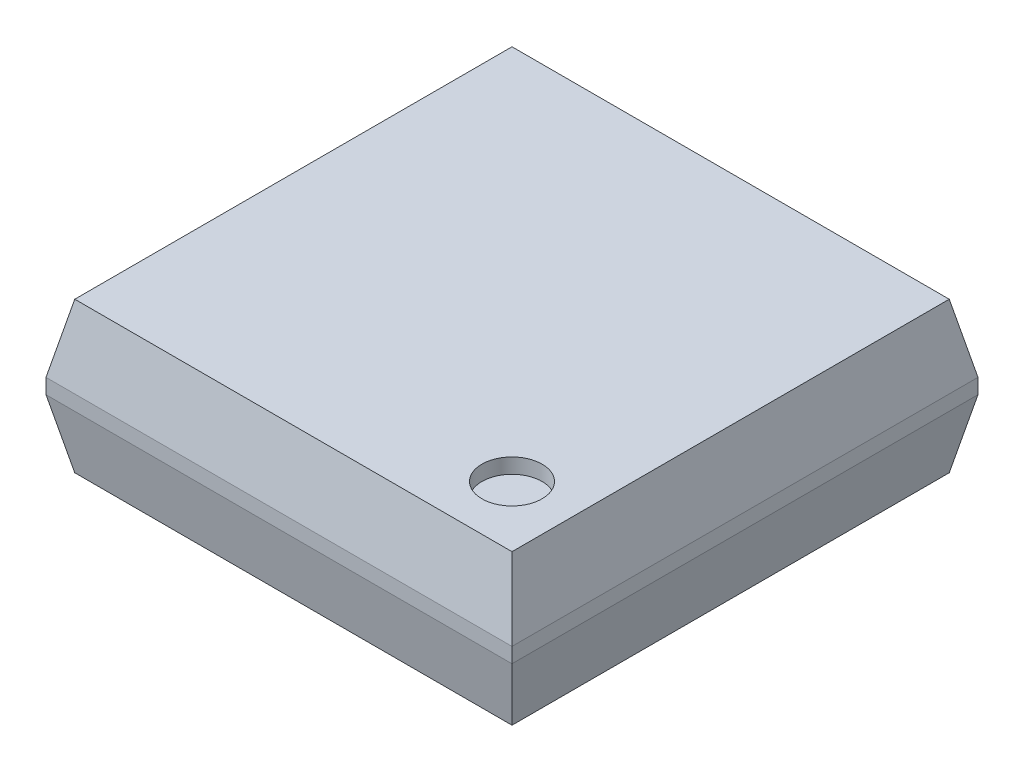
ISO-10303-21;
HEADER;
FILE_DESCRIPTION(('STEP AP214'),'2;1');
FILE_NAME('part.step','',(''),(''),'','','');
FILE_SCHEMA(('AUTOMOTIVE_DESIGN { 1 0 10303 214 1 1 1 1 }'));
ENDSEC;
DATA;
#1=APPLICATION_CONTEXT('core data for automotive mechanical design processes');
#2=APPLICATION_PROTOCOL_DEFINITION('international standard','automotive_design',2000,#1);
#3=PRODUCT_CONTEXT('',#1,'mechanical');
#4=PRODUCT('Part','Part','',(#3));
#5=PRODUCT_RELATED_PRODUCT_CATEGORY('part','',(#4));
#6=PRODUCT_DEFINITION_FORMATION('','',#4);
#7=PRODUCT_DEFINITION_CONTEXT('part definition',#1,'design');
#8=PRODUCT_DEFINITION('design','',#6,#7);
#9=PRODUCT_DEFINITION_SHAPE('','',#8);
#10=(LENGTH_UNIT() NAMED_UNIT(*) SI_UNIT(.MILLI.,.METRE.));
#11=(NAMED_UNIT(*) PLANE_ANGLE_UNIT() SI_UNIT($,.RADIAN.));
#12=(NAMED_UNIT(*) SI_UNIT($,.STERADIAN.) SOLID_ANGLE_UNIT());
#13=UNCERTAINTY_MEASURE_WITH_UNIT(LENGTH_MEASURE(1.E-05),#10,'distance_accuracy_value','');
#14=(GEOMETRIC_REPRESENTATION_CONTEXT(3) GLOBAL_UNCERTAINTY_ASSIGNED_CONTEXT((#13)) GLOBAL_UNIT_ASSIGNED_CONTEXT((#10,
#11,#12)) REPRESENTATION_CONTEXT('',''));
#15=CARTESIAN_POINT('',(0.,0.,0.));
#16=DIRECTION('',(0.,0.,1.));
#17=DIRECTION('',(1.,0.,0.));
#18=AXIS2_PLACEMENT_3D('',#15,#16,#17);
#19=CARTESIAN_POINT('',(-1.55,-0.5,1.55));
#20=DIRECTION('',(0.,1.,0.));
#21=DIRECTION('',(1.,0.,0.));
#22=AXIS2_PLACEMENT_3D('',#19,#20,#21);
#23=PLANE('',#22);
#24=DIRECTION('',(0.,0.,-1.));
#25=VECTOR('',#24,1.);
#26=CARTESIAN_POINT('',(1.454349547248,-0.5,1.55));
#27=LINE('',#26,#25);
#28=CARTESIAN_POINT('',(1.454349547248,-0.5,1.454349547248));
#29=VERTEX_POINT('',#28);
#30=CARTESIAN_POINT('',(1.454349547248,-0.5,-1.454349547248));
#31=VERTEX_POINT('',#30);
#32=EDGE_CURVE('E28',#29,#31,#27,.T.);
#33=ORIENTED_EDGE('',*,*,#32,.F.);
#34=DIRECTION('',(1.,0.,0.));
#35=VECTOR('',#34,1.);
#36=CARTESIAN_POINT('',(-1.55,-0.5,1.454349547248));
#37=LINE('',#36,#35);
#38=CARTESIAN_POINT('',(-1.454349547248,-0.5,1.454349547248));
#39=VERTEX_POINT('',#38);
#40=EDGE_CURVE('E141',#39,#29,#37,.T.);
#41=ORIENTED_EDGE('',*,*,#40,.F.);
#42=DIRECTION('',(0.,0.,1.));
#43=VECTOR('',#42,1.);
#44=CARTESIAN_POINT('',(-1.454349547248,-0.5,1.55));
#45=LINE('',#44,#43);
#46=CARTESIAN_POINT('',(-1.454349547248,-0.5,-1.454349547248));
#47=VERTEX_POINT('',#46);
#48=EDGE_CURVE('E164',#47,#39,#45,.T.);
#49=ORIENTED_EDGE('',*,*,#48,.F.);
#50=DIRECTION('',(-1.,0.,0.));
#51=VECTOR('',#50,1.);
#52=CARTESIAN_POINT('',(-1.55,-0.5,-1.454349547248));
#53=LINE('',#52,#51);
#54=EDGE_CURVE('E11',#31,#47,#53,.T.);
#55=ORIENTED_EDGE('',*,*,#54,.F.);
#56=EDGE_LOOP('',(#33,#41,#49,#55));
#57=FACE_BOUND('',#56,.T.);
#58=ADVANCED_FACE('F17',(#57),#23,.F.);
#59=CARTESIAN_POINT('',(-1.55,-0.04999999999999,-1.55));
#60=DIRECTION('',(0.,-0.20791169081795,-0.978147600733765));
#61=DIRECTION('',(0.,-0.978147600733765,0.20791169081795));
#62=AXIS2_PLACEMENT_3D('',#59,#60,#61);
#63=PLANE('',#62);
#64=DIRECTION('',(-0.203558594952977,-0.957667894857889,0.203558594952977));
#65=VECTOR('',#64,1.);
#66=CARTESIAN_POINT('',(1.55,-0.04999999999999,-1.55));
#67=LINE('',#66,#65);
#68=CARTESIAN_POINT('',(1.55,-0.04999999999999,-1.55));
#69=VERTEX_POINT('',#68);
#70=EDGE_CURVE('E139',#69,#31,#67,.T.);
#71=ORIENTED_EDGE('',*,*,#70,.T.);
#72=ORIENTED_EDGE('',*,*,#54,.T.);
#73=DIRECTION('',(-0.203558594952977,0.957667894857889,-0.203558594952977));
#74=VECTOR('',#73,1.);
#75=CARTESIAN_POINT('',(-1.454349547248,-0.5,-1.454349547248));
#76=LINE('',#75,#74);
#77=CARTESIAN_POINT('',(-1.55,-0.04999999999999,-1.55));
#78=VERTEX_POINT('',#77);
#79=EDGE_CURVE('E161',#47,#78,#76,.T.);
#80=ORIENTED_EDGE('',*,*,#79,.T.);
#81=DIRECTION('',(1.,0.,0.));
#82=VECTOR('',#81,1.);
#83=CARTESIAN_POINT('',(-1.55,-0.04999999999999,-1.55));
#84=LINE('',#83,#82);
#85=EDGE_CURVE('E182',#78,#69,#84,.T.);
#86=ORIENTED_EDGE('',*,*,#85,.T.);
#87=EDGE_LOOP('',(#71,#72,#80,#86));
#88=FACE_BOUND('',#87,.T.);
#89=ADVANCED_FACE('F240',(#88),#63,.T.);
#90=CARTESIAN_POINT('',(1.55,-0.04999999999999,-1.55));
#91=DIRECTION('',(0.978147600733765,-0.20791169081795,0.));
#92=DIRECTION('',(0.,0.,-1.));
#93=AXIS2_PLACEMENT_3D('',#90,#91,#92);
#94=PLANE('',#93);
#95=ORIENTED_EDGE('',*,*,#70,.F.);
#96=DIRECTION('',(0.,0.,1.));
#97=VECTOR('',#96,1.);
#98=CARTESIAN_POINT('',(1.55,-0.04999999999999,-1.55));
#99=LINE('',#98,#97);
#100=CARTESIAN_POINT('',(1.55,-0.04999999999999,1.55));
#101=VERTEX_POINT('',#100);
#102=EDGE_CURVE('E194',#69,#101,#99,.T.);
#103=ORIENTED_EDGE('',*,*,#102,.T.);
#104=DIRECTION('',(-0.203558594952977,-0.957667894857889,-0.203558594952977));
#105=VECTOR('',#104,1.);
#106=CARTESIAN_POINT('',(1.55,-0.04999999999999,1.55));
#107=LINE('',#106,#105);
#108=EDGE_CURVE('E195',#101,#29,#107,.T.);
#109=ORIENTED_EDGE('',*,*,#108,.T.);
#110=ORIENTED_EDGE('',*,*,#32,.T.);
#111=EDGE_LOOP('',(#95,#103,#109,#110));
#112=FACE_BOUND('',#111,.T.);
#113=ADVANCED_FACE('F267',(#112),#94,.T.);
#114=CARTESIAN_POINT('',(-1.55,-0.04999999999999,1.55));
#115=DIRECTION('',(0.,-0.20791169081795,0.978147600733765));
#116=DIRECTION('',(-1.,0.,0.));
#117=AXIS2_PLACEMENT_3D('',#114,#115,#116);
#118=PLANE('',#117);
#119=ORIENTED_EDGE('',*,*,#108,.F.);
#120=DIRECTION('',(-1.,0.,0.));
#121=VECTOR('',#120,1.);
#122=CARTESIAN_POINT('',(-1.55,-0.04999999999999,1.55));
#123=LINE('',#122,#121);
#124=CARTESIAN_POINT('',(-1.55,-0.04999999999999,1.55));
#125=VERTEX_POINT('',#124);
#126=EDGE_CURVE('E148',#101,#125,#123,.T.);
#127=ORIENTED_EDGE('',*,*,#126,.T.);
#128=DIRECTION('',(0.203558594952977,-0.957667894857889,-0.203558594952977));
#129=VECTOR('',#128,1.);
#130=CARTESIAN_POINT('',(-1.55,-0.04999999999999,1.55));
#131=LINE('',#130,#129);
#132=EDGE_CURVE('E165',#125,#39,#131,.T.);
#133=ORIENTED_EDGE('',*,*,#132,.T.);
#134=ORIENTED_EDGE('',*,*,#40,.T.);
#135=EDGE_LOOP('',(#119,#127,#133,#134));
#136=FACE_BOUND('',#135,.T.);
#137=ADVANCED_FACE('F265',(#136),#118,.T.);
#138=CARTESIAN_POINT('',(-1.55,-0.04999999999999,-1.55));
#139=DIRECTION('',(-0.978147600733765,-0.20791169081795,0.));
#140=DIRECTION('',(-0.20791169081795,0.978147600733765,0.));
#141=AXIS2_PLACEMENT_3D('',#138,#139,#140);
#142=PLANE('',#141);
#143=ORIENTED_EDGE('',*,*,#132,.F.);
#144=DIRECTION('',(0.,0.,-1.));
#145=VECTOR('',#144,1.);
#146=CARTESIAN_POINT('',(-1.55,-0.04999999999999,-1.55));
#147=LINE('',#146,#145);
#148=EDGE_CURVE('E94',#125,#78,#147,.T.);
#149=ORIENTED_EDGE('',*,*,#148,.T.);
#150=ORIENTED_EDGE('',*,*,#79,.F.);
#151=ORIENTED_EDGE('',*,*,#48,.T.);
#152=EDGE_LOOP('',(#143,#149,#150,#151));
#153=FACE_BOUND('',#152,.T.);
#154=ADVANCED_FACE('F246',(#153),#142,.T.);
#155=CARTESIAN_POINT('',(-1.55,-0.5,-1.55));
#156=DIRECTION('',(0.,0.,-1.));
#157=DIRECTION('',(0.,-1.,0.));
#158=AXIS2_PLACEMENT_3D('',#155,#156,#157);
#159=PLANE('',#158);
#160=DIRECTION('',(0.,1.,0.));
#161=VECTOR('',#160,1.);
#162=CARTESIAN_POINT('',(-1.55,-0.5,-1.55));
#163=LINE('',#162,#161);
#164=CARTESIAN_POINT('',(-1.55,0.04999999999999,-1.55));
#165=VERTEX_POINT('',#164);
#166=EDGE_CURVE('E98',#78,#165,#163,.T.);
#167=ORIENTED_EDGE('',*,*,#166,.T.);
#168=DIRECTION('',(1.,0.,0.));
#169=VECTOR('',#168,1.);
#170=CARTESIAN_POINT('',(-1.55,0.04999999999999,-1.55));
#171=LINE('',#170,#169);
#172=CARTESIAN_POINT('',(1.55,0.04999999999999,-1.55));
#173=VERTEX_POINT('',#172);
#174=EDGE_CURVE('E99',#165,#173,#171,.T.);
#175=ORIENTED_EDGE('',*,*,#174,.T.);
#176=DIRECTION('',(0.,-1.,0.));
#177=VECTOR('',#176,1.);
#178=CARTESIAN_POINT('',(1.55,-0.5,-1.55));
#179=LINE('',#178,#177);
#180=EDGE_CURVE('E152',#173,#69,#179,.T.);
#181=ORIENTED_EDGE('',*,*,#180,.T.);
#182=ORIENTED_EDGE('',*,*,#85,.F.);
#183=EDGE_LOOP('',(#167,#175,#181,#182));
#184=FACE_BOUND('',#183,.T.);
#185=ADVANCED_FACE('F249',(#184),#159,.T.);
#186=CARTESIAN_POINT('',(1.55,-0.5,-1.55));
#187=DIRECTION('',(1.,0.,0.));
#188=DIRECTION('',(0.,1.,0.));
#189=AXIS2_PLACEMENT_3D('',#186,#187,#188);
#190=PLANE('',#189);
#191=ORIENTED_EDGE('',*,*,#180,.F.);
#192=DIRECTION('',(0.,0.,1.));
#193=VECTOR('',#192,1.);
#194=CARTESIAN_POINT('',(1.55,0.04999999999999,-1.55));
#195=LINE('',#194,#193);
#196=CARTESIAN_POINT('',(1.55,0.04999999999999,1.55));
#197=VERTEX_POINT('',#196);
#198=EDGE_CURVE('E21',#173,#197,#195,.T.);
#199=ORIENTED_EDGE('',*,*,#198,.T.);
#200=DIRECTION('',(0.,-1.,0.));
#201=VECTOR('',#200,1.);
#202=CARTESIAN_POINT('',(1.55,-0.5,1.55));
#203=LINE('',#202,#201);
#204=EDGE_CURVE('E106',#197,#101,#203,.T.);
#205=ORIENTED_EDGE('',*,*,#204,.T.);
#206=ORIENTED_EDGE('',*,*,#102,.F.);
#207=EDGE_LOOP('',(#191,#199,#205,#206));
#208=FACE_BOUND('',#207,.T.);
#209=ADVANCED_FACE('F19',(#208),#190,.T.);
#210=CARTESIAN_POINT('',(-1.55,-0.5,1.55));
#211=DIRECTION('',(0.,0.,1.));
#212=DIRECTION('',(1.,0.,0.));
#213=AXIS2_PLACEMENT_3D('',#210,#211,#212);
#214=PLANE('',#213);
#215=ORIENTED_EDGE('',*,*,#204,.F.);
#216=DIRECTION('',(-1.,0.,0.));
#217=VECTOR('',#216,1.);
#218=CARTESIAN_POINT('',(-1.55,0.04999999999999,1.55));
#219=LINE('',#218,#217);
#220=CARTESIAN_POINT('',(-1.55,0.04999999999999,1.55));
#221=VERTEX_POINT('',#220);
#222=EDGE_CURVE('E102',#197,#221,#219,.T.);
#223=ORIENTED_EDGE('',*,*,#222,.T.);
#224=DIRECTION('',(0.,-1.,0.));
#225=VECTOR('',#224,1.);
#226=CARTESIAN_POINT('',(-1.55,-0.5,1.55));
#227=LINE('',#226,#225);
#228=EDGE_CURVE('E87',#221,#125,#227,.T.);
#229=ORIENTED_EDGE('',*,*,#228,.T.);
#230=ORIENTED_EDGE('',*,*,#126,.F.);
#231=EDGE_LOOP('',(#215,#223,#229,#230));
#232=FACE_BOUND('',#231,.T.);
#233=ADVANCED_FACE('F104',(#232),#214,.T.);
#234=CARTESIAN_POINT('',(-1.55,-0.5,-1.55));
#235=DIRECTION('',(-1.,0.,0.));
#236=DIRECTION('',(0.,0.,1.));
#237=AXIS2_PLACEMENT_3D('',#234,#235,#236);
#238=PLANE('',#237);
#239=ORIENTED_EDGE('',*,*,#228,.F.);
#240=DIRECTION('',(0.,0.,-1.));
#241=VECTOR('',#240,1.);
#242=CARTESIAN_POINT('',(-1.55,0.04999999999999,-1.55));
#243=LINE('',#242,#241);
#244=EDGE_CURVE('E92',#221,#165,#243,.T.);
#245=ORIENTED_EDGE('',*,*,#244,.T.);
#246=ORIENTED_EDGE('',*,*,#166,.F.);
#247=ORIENTED_EDGE('',*,*,#148,.F.);
#248=EDGE_LOOP('',(#239,#245,#246,#247));
#249=FACE_BOUND('',#248,.T.);
#250=ADVANCED_FACE('F89',(#249),#238,.T.);
#251=CARTESIAN_POINT('',(-1.55,0.5,-1.454349547248));
#252=DIRECTION('',(0.,-0.20791169081795,0.978147600733765));
#253=DIRECTION('',(-1.,0.,0.));
#254=AXIS2_PLACEMENT_3D('',#251,#252,#253);
#255=PLANE('',#254);
#256=ORIENTED_EDGE('',*,*,#174,.F.);
#257=DIRECTION('',(-0.203558594952977,-0.957667894857889,-0.203558594952977));
#258=VECTOR('',#257,1.);
#259=CARTESIAN_POINT('',(-1.454349547248,0.5,-1.454349547248));
#260=LINE('',#259,#258);
#261=CARTESIAN_POINT('',(-1.454349547248,0.5,-1.454349547248));
#262=VERTEX_POINT('',#261);
#263=EDGE_CURVE('E112',#262,#165,#260,.T.);
#264=ORIENTED_EDGE('',*,*,#263,.F.);
#265=DIRECTION('',(-1.,0.,0.));
#266=VECTOR('',#265,1.);
#267=CARTESIAN_POINT('',(-1.55,0.5,-1.454349547248));
#268=LINE('',#267,#266);
#269=CARTESIAN_POINT('',(1.454349547248,0.5,-1.454349547248));
#270=VERTEX_POINT('',#269);
#271=EDGE_CURVE('E133',#270,#262,#268,.T.);
#272=ORIENTED_EDGE('',*,*,#271,.F.);
#273=DIRECTION('',(-0.203558594952977,0.957667894857889,0.203558594952977));
#274=VECTOR('',#273,1.);
#275=CARTESIAN_POINT('',(1.55,0.04999999999999,-1.55));
#276=LINE('',#275,#274);
#277=EDGE_CURVE('E186',#173,#270,#276,.T.);
#278=ORIENTED_EDGE('',*,*,#277,.F.);
#279=EDGE_LOOP('',(#256,#264,#272,#278));
#280=FACE_BOUND('',#279,.T.);
#281=ADVANCED_FACE('F251',(#280),#255,.F.);
#282=CARTESIAN_POINT('',(1.454349547248,0.5,1.55));
#283=DIRECTION('',(-0.978147600733765,-0.20791169081795,0.));
#284=DIRECTION('',(-0.20791169081795,0.978147600733765,0.));
#285=AXIS2_PLACEMENT_3D('',#282,#283,#284);
#286=PLANE('',#285);
#287=ORIENTED_EDGE('',*,*,#198,.F.);
#288=ORIENTED_EDGE('',*,*,#277,.T.);
#289=DIRECTION('',(0.,0.,-1.));
#290=VECTOR('',#289,1.);
#291=CARTESIAN_POINT('',(1.454349547248,0.5,1.55));
#292=LINE('',#291,#290);
#293=CARTESIAN_POINT('',(1.454349547248,0.5,1.454349547248));
#294=VERTEX_POINT('',#293);
#295=EDGE_CURVE('E137',#294,#270,#292,.T.);
#296=ORIENTED_EDGE('',*,*,#295,.F.);
#297=DIRECTION('',(-0.203558594952977,0.957667894857889,-0.203558594952977));
#298=VECTOR('',#297,1.);
#299=CARTESIAN_POINT('',(1.55,0.04999999999999,1.55));
#300=LINE('',#299,#298);
#301=EDGE_CURVE('E111',#197,#294,#300,.T.);
#302=ORIENTED_EDGE('',*,*,#301,.F.);
#303=EDGE_LOOP('',(#287,#288,#296,#302));
#304=FACE_BOUND('',#303,.T.);
#305=ADVANCED_FACE('F218',(#304),#286,.F.);
#306=CARTESIAN_POINT('',(-1.55,0.5,1.454349547248));
#307=DIRECTION('',(0.,-0.20791169081795,-0.978147600733765));
#308=DIRECTION('',(0.,-0.978147600733765,0.20791169081795));
#309=AXIS2_PLACEMENT_3D('',#306,#307,#308);
#310=PLANE('',#309);
#311=DIRECTION('',(1.,0.,0.));
#312=VECTOR('',#311,1.);
#313=CARTESIAN_POINT('',(-1.55,0.5,1.454349547248));
#314=LINE('',#313,#312);
#315=CARTESIAN_POINT('',(-1.454349547248,0.5,1.454349547248));
#316=VERTEX_POINT('',#315);
#317=EDGE_CURVE('E118',#316,#294,#314,.T.);
#318=ORIENTED_EDGE('',*,*,#317,.F.);
#319=DIRECTION('',(0.203558594952977,0.957667894857889,-0.203558594952977));
#320=VECTOR('',#319,1.);
#321=CARTESIAN_POINT('',(-1.55,0.04999999999999,1.55));
#322=LINE('',#321,#320);
#323=EDGE_CURVE('E115',#221,#316,#322,.T.);
#324=ORIENTED_EDGE('',*,*,#323,.F.);
#325=ORIENTED_EDGE('',*,*,#222,.F.);
#326=ORIENTED_EDGE('',*,*,#301,.T.);
#327=EDGE_LOOP('',(#318,#324,#325,#326));
#328=FACE_BOUND('',#327,.T.);
#329=ADVANCED_FACE('F116',(#328),#310,.F.);
#330=CARTESIAN_POINT('',(-1.454349547248,0.5,1.55));
#331=DIRECTION('',(0.978147600733765,-0.20791169081795,0.));
#332=DIRECTION('',(0.,0.,-1.));
#333=AXIS2_PLACEMENT_3D('',#330,#331,#332);
#334=PLANE('',#333);
#335=ORIENTED_EDGE('',*,*,#244,.F.);
#336=ORIENTED_EDGE('',*,*,#323,.T.);
#337=DIRECTION('',(0.,0.,1.));
#338=VECTOR('',#337,1.);
#339=CARTESIAN_POINT('',(-1.454349547248,0.5,1.55));
#340=LINE('',#339,#338);
#341=EDGE_CURVE('E127',#262,#316,#340,.T.);
#342=ORIENTED_EDGE('',*,*,#341,.F.);
#343=ORIENTED_EDGE('',*,*,#263,.T.);
#344=EDGE_LOOP('',(#335,#336,#342,#343));
#345=FACE_BOUND('',#344,.T.);
#346=ADVANCED_FACE('F125',(#345),#334,.F.);
#347=CARTESIAN_POINT('',(-1.55,0.5,1.55));
#348=DIRECTION('',(0.,1.,0.));
#349=DIRECTION('',(1.,0.,0.));
#350=AXIS2_PLACEMENT_3D('',#347,#348,#349);
#351=PLANE('',#350);
#352=CARTESIAN_POINT('',(1.05,0.5,1.05));
#353=DIRECTION('',(0.,-1.,0.));
#354=DIRECTION('',(0.,0.,1.));
#355=AXIS2_PLACEMENT_3D('',#352,#353,#354);
#356=CIRCLE('',#355,0.2);
#357=CARTESIAN_POINT('',(1.05,0.5,1.25));
#358=VERTEX_POINT('',#357);
#359=EDGE_CURVE('E155',#358,#358,#356,.T.);
#360=ORIENTED_EDGE('',*,*,#359,.T.);
#361=EDGE_LOOP('',(#360));
#362=FACE_BOUND('',#361,.T.);
#363=ORIENTED_EDGE('',*,*,#317,.T.);
#364=ORIENTED_EDGE('',*,*,#295,.T.);
#365=ORIENTED_EDGE('',*,*,#271,.T.);
#366=ORIENTED_EDGE('',*,*,#341,.T.);
#367=EDGE_LOOP('',(#363,#364,#365,#366));
#368=FACE_BOUND('',#367,.T.);
#369=ADVANCED_FACE('F278',(#362,#368),#351,.T.);
#370=CARTESIAN_POINT('',(1.05,0.4,1.05));
#371=DIRECTION('',(0.,1.,0.));
#372=DIRECTION('',(0.,0.,1.));
#373=AXIS2_PLACEMENT_3D('',#370,#371,#372);
#374=CYLINDRICAL_SURFACE('',#373,0.2);
#375=CARTESIAN_POINT('',(1.05,0.4,1.25));
#376=CARTESIAN_POINT('',(1.05,0.5,1.25));
#377=(BOUNDED_CURVE() B_SPLINE_CURVE(1,(#375,#376),.UNSPECIFIED.,.F.,
.F.) B_SPLINE_CURVE_WITH_KNOTS((2,2),(0.,0.1),
.UNSPECIFIED.) CURVE() GEOMETRIC_REPRESENTATION_ITEM() RATIONAL_B_SPLINE_CURVE((1.,1.)) REPRESENTATION_ITEM(''));
#378=CARTESIAN_POINT('',(1.05,0.4,1.25));
#379=VERTEX_POINT('',#378);
#380=EDGE_CURVE('E147',#379,#358,#377,.T.);
#381=ORIENTED_EDGE('',*,*,#380,.F.);
#382=CARTESIAN_POINT('',(1.05,0.4,1.05));
#383=DIRECTION('',(0.,1.,0.));
#384=DIRECTION('',(0.,0.,1.));
#385=AXIS2_PLACEMENT_3D('',#382,#383,#384);
#386=CIRCLE('',#385,0.2);
#387=EDGE_CURVE('E143',#379,#379,#386,.T.);
#388=ORIENTED_EDGE('',*,*,#387,.F.);
#389=ORIENTED_EDGE('',*,*,#380,.T.);
#390=ORIENTED_EDGE('',*,*,#359,.F.);
#391=EDGE_LOOP('',(#381,#388,#389,#390));
#392=FACE_BOUND('',#391,.T.);
#393=ADVANCED_FACE('F280',(#392),#374,.F.);
#394=CARTESIAN_POINT('',(1.05,0.4,1.05));
#395=DIRECTION('',(0.,1.,0.));
#396=DIRECTION('',(1.,0.,0.));
#397=AXIS2_PLACEMENT_3D('',#394,#395,#396);
#398=PLANE('',#397);
#399=ORIENTED_EDGE('',*,*,#387,.T.);
#400=EDGE_LOOP('',(#399));
#401=FACE_BOUND('',#400,.T.);
#402=ADVANCED_FACE('F289',(#401),#398,.T.);
#403=CLOSED_SHELL('',(#58,#89,#113,#137,#154,#185,#209,#233,#250,#281,#305,#329,#346,#369,#393,#402));
#404=MANIFOLD_SOLID_BREP('B1',#403);
#405=ADVANCED_BREP_SHAPE_REPRESENTATION('',(#18,#404),#14);
#406=SHAPE_DEFINITION_REPRESENTATION(#9,#405);
ENDSEC;
END-ISO-10303-21;
